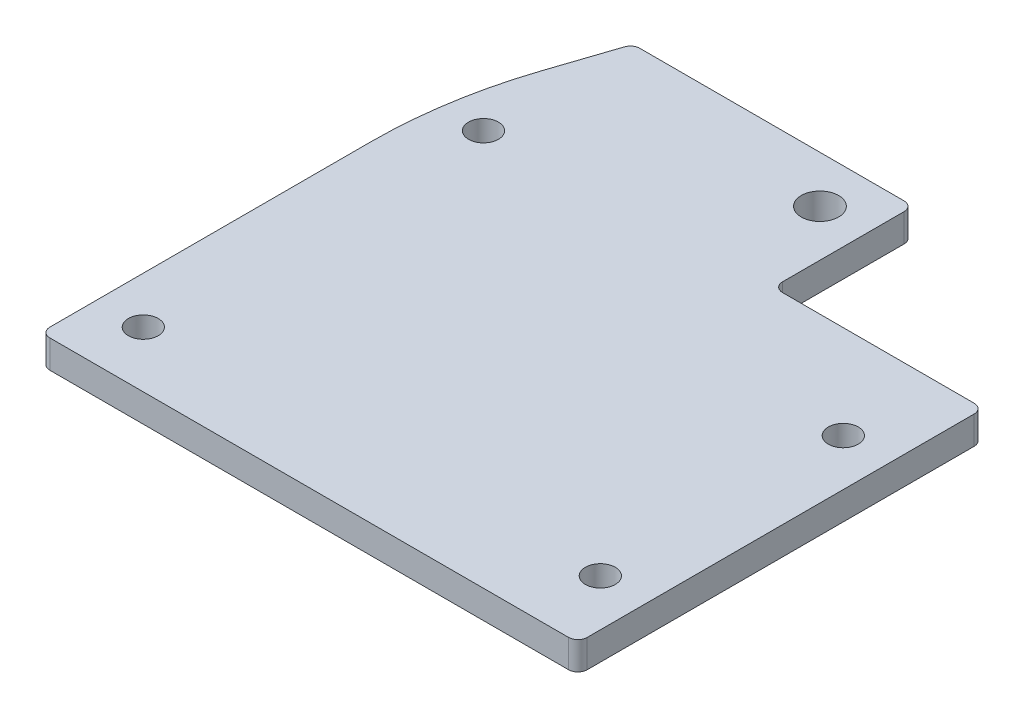
ISO-10303-21;
HEADER;
FILE_DESCRIPTION(('STEP AP214'),'2;1');
FILE_NAME('part.step','',(''),(''),'','','');
FILE_SCHEMA(('AUTOMOTIVE_DESIGN { 1 0 10303 214 1 1 1 1 }'));
ENDSEC;
DATA;
#1=APPLICATION_CONTEXT('core data for automotive mechanical design processes');
#2=APPLICATION_PROTOCOL_DEFINITION('international standard','automotive_design',2000,#1);
#3=PRODUCT_CONTEXT('',#1,'mechanical');
#4=PRODUCT('Part','Part','',(#3));
#5=PRODUCT_RELATED_PRODUCT_CATEGORY('part','',(#4));
#6=PRODUCT_DEFINITION_FORMATION('','',#4);
#7=PRODUCT_DEFINITION_CONTEXT('part definition',#1,'design');
#8=PRODUCT_DEFINITION('design','',#6,#7);
#9=PRODUCT_DEFINITION_SHAPE('','',#8);
#10=(LENGTH_UNIT() NAMED_UNIT(*) SI_UNIT(.MILLI.,.METRE.));
#11=(NAMED_UNIT(*) PLANE_ANGLE_UNIT() SI_UNIT($,.RADIAN.));
#12=(NAMED_UNIT(*) SI_UNIT($,.STERADIAN.) SOLID_ANGLE_UNIT());
#13=UNCERTAINTY_MEASURE_WITH_UNIT(LENGTH_MEASURE(1.E-05),#10,'distance_accuracy_value','');
#14=(GEOMETRIC_REPRESENTATION_CONTEXT(3) GLOBAL_UNCERTAINTY_ASSIGNED_CONTEXT((#13)) GLOBAL_UNIT_ASSIGNED_CONTEXT((#10,
#11,#12)) REPRESENTATION_CONTEXT('',''));
#15=CARTESIAN_POINT('',(0.,0.,0.));
#16=DIRECTION('',(0.,0.,1.));
#17=DIRECTION('',(1.,0.,0.));
#18=AXIS2_PLACEMENT_3D('',#15,#16,#17);
#19=CARTESIAN_POINT('',(0.,3.,0.));
#20=DIRECTION('',(0.,-1.,0.));
#21=DIRECTION('',(0.,0.,-1.));
#22=AXIS2_PLACEMENT_3D('',#19,#20,#21);
#23=PLANE('',#22);
#24=DIRECTION('',(0.,0.,1.));
#25=VECTOR('',#24,1.);
#26=CARTESIAN_POINT('',(0.,3.,0.));
#27=LINE('',#26,#25);
#28=CARTESIAN_POINT('',(0.,3.,-35.286116991581));
#29=VERTEX_POINT('',#28);
#30=CARTESIAN_POINT('',(0.,3.,-1.));
#31=VERTEX_POINT('',#30);
#32=EDGE_CURVE('E195',#29,#31,#27,.T.);
#33=ORIENTED_EDGE('',*,*,#32,.T.);
#34=CARTESIAN_POINT('',(1.,3.,-1.));
#35=DIRECTION('',(0.,-1.,0.));
#36=DIRECTION('',(0.,0.,-1.));
#37=AXIS2_PLACEMENT_3D('',#34,#35,#36);
#38=CIRCLE('',#37,1.);
#39=CARTESIAN_POINT('',(1.,3.,0.));
#40=VERTEX_POINT('',#39);
#41=EDGE_CURVE('E269',#31,#40,#38,.F.);
#42=ORIENTED_EDGE('',*,*,#41,.T.);
#43=DIRECTION('',(1.,0.,0.));
#44=VECTOR('',#43,1.);
#45=CARTESIAN_POINT('',(0.,3.,0.));
#46=LINE('',#45,#44);
#47=CARTESIAN_POINT('',(56.5,3.,0.));
#48=VERTEX_POINT('',#47);
#49=EDGE_CURVE('E199',#40,#48,#46,.T.);
#50=ORIENTED_EDGE('',*,*,#49,.T.);
#51=CARTESIAN_POINT('',(56.5,3.,-1.));
#52=DIRECTION('',(0.,-1.,0.));
#53=DIRECTION('',(0.,0.,-1.));
#54=AXIS2_PLACEMENT_3D('',#51,#52,#53);
#55=CIRCLE('',#54,1.);
#56=CARTESIAN_POINT('',(57.5,3.,-1.));
#57=VERTEX_POINT('',#56);
#58=EDGE_CURVE('E266',#48,#57,#55,.F.);
#59=ORIENTED_EDGE('',*,*,#58,.T.);
#60=DIRECTION('',(0.,0.,-1.));
#61=VECTOR('',#60,1.);
#62=CARTESIAN_POINT('',(57.5,3.,0.));
#63=LINE('',#62,#61);
#64=CARTESIAN_POINT('',(57.5,3.,-42.4));
#65=VERTEX_POINT('',#64);
#66=EDGE_CURVE('E209',#57,#65,#63,.T.);
#67=ORIENTED_EDGE('',*,*,#66,.T.);
#68=CARTESIAN_POINT('',(56.5,3.,-42.4));
#69=DIRECTION('',(0.,-1.,0.));
#70=DIRECTION('',(0.,0.,-1.));
#71=AXIS2_PLACEMENT_3D('',#68,#69,#70);
#72=CIRCLE('',#71,1.);
#73=CARTESIAN_POINT('',(56.5,3.,-43.4));
#74=VERTEX_POINT('',#73);
#75=EDGE_CURVE('E263',#65,#74,#72,.F.);
#76=ORIENTED_EDGE('',*,*,#75,.T.);
#77=DIRECTION('',(-1.,0.,0.));
#78=VECTOR('',#77,1.);
#79=CARTESIAN_POINT('',(35.,3.,-43.4));
#80=LINE('',#79,#78);
#81=CARTESIAN_POINT('',(36.,3.,-43.4));
#82=VERTEX_POINT('',#81);
#83=EDGE_CURVE('E213',#74,#82,#80,.T.);
#84=ORIENTED_EDGE('',*,*,#83,.T.);
#85=CARTESIAN_POINT('',(36.,3.,-44.4));
#86=DIRECTION('',(0.,-1.,0.));
#87=DIRECTION('',(0.,0.,-1.));
#88=AXIS2_PLACEMENT_3D('',#85,#86,#87);
#89=CIRCLE('',#88,1.);
#90=CARTESIAN_POINT('',(35.,3.,-44.4));
#91=VERTEX_POINT('',#90);
#92=EDGE_CURVE('E12',#82,#91,#89,.T.);
#93=ORIENTED_EDGE('',*,*,#92,.T.);
#94=DIRECTION('',(0.,0.,-1.));
#95=VECTOR('',#94,1.);
#96=CARTESIAN_POINT('',(35.,3.,-58.4));
#97=LINE('',#96,#95);
#98=CARTESIAN_POINT('',(35.,3.,-57.4));
#99=VERTEX_POINT('',#98);
#100=EDGE_CURVE('E218',#91,#99,#97,.T.);
#101=ORIENTED_EDGE('',*,*,#100,.T.);
#102=CARTESIAN_POINT('',(34.,3.,-57.4));
#103=DIRECTION('',(0.,-1.,0.));
#104=DIRECTION('',(0.,0.,-1.));
#105=AXIS2_PLACEMENT_3D('',#102,#103,#104);
#106=CIRCLE('',#105,1.);
#107=CARTESIAN_POINT('',(34.,3.,-58.4));
#108=VERTEX_POINT('',#107);
#109=EDGE_CURVE('E67',#99,#108,#106,.F.);
#110=ORIENTED_EDGE('',*,*,#109,.T.);
#111=DIRECTION('',(-1.,0.,0.));
#112=VECTOR('',#111,1.);
#113=CARTESIAN_POINT('',(0.,3.,-58.4));
#114=LINE('',#113,#112);
#115=CARTESIAN_POINT('',(5.72075922005612,3.,-58.4));
#116=VERTEX_POINT('',#115);
#117=EDGE_CURVE('E165',#108,#116,#114,.T.);
#118=ORIENTED_EDGE('',*,*,#117,.T.);
#119=CARTESIAN_POINT('',(5.72075922005612,3.,-57.4));
#120=DIRECTION('',(0.,-1.,0.));
#121=DIRECTION('',(0.,0.,-1.));
#122=AXIS2_PLACEMENT_3D('',#119,#120,#121);
#123=CIRCLE('',#122,1.);
#124=CARTESIAN_POINT('',(4.77207592200561,3.,-57.7162277660168));
#125=VERTEX_POINT('',#124);
#126=EDGE_CURVE('E59',#116,#125,#123,.F.);
#127=ORIENTED_EDGE('',*,*,#126,.T.);
#128=DIRECTION('',(0.316227766016838,0.,-0.948683298050514));
#129=VECTOR('',#128,1.);
#130=CARTESIAN_POINT('',(0.,3.,-43.4));
#131=LINE('',#130,#129);
#132=CARTESIAN_POINT('',(2.56583509747431,3.,-51.0975052924229));
#133=VERTEX_POINT('',#132);
#134=EDGE_CURVE('E162',#133,#125,#131,.T.);
#135=ORIENTED_EDGE('',*,*,#134,.F.);
#136=CARTESIAN_POINT('',(50.,3.,-35.286116991581));
#137=DIRECTION('',(0.,-1.,0.));
#138=DIRECTION('',(0.,0.,-1.));
#139=AXIS2_PLACEMENT_3D('',#136,#137,#138);
#140=CIRCLE('',#139,50.);
#141=EDGE_CURVE('E147',#133,#29,#140,.F.);
#142=ORIENTED_EDGE('',*,*,#141,.T.);
#143=EDGE_LOOP('',(#33,#42,#50,#59,#67,#76,#84,#93,#101,#110,#118,#127,#135,#142));
#144=FACE_BOUND('',#143,.T.);
#145=CARTESIAN_POINT('',(52.5,3.,-7.4));
#146=DIRECTION('',(0.,1.,0.));
#147=DIRECTION('',(0.,0.,1.));
#148=AXIS2_PLACEMENT_3D('',#145,#146,#147);
#149=CIRCLE('',#148,1.6);
#150=CARTESIAN_POINT('',(52.5,3.,-5.8));
#151=VERTEX_POINT('',#150);
#152=EDGE_CURVE('E183',#151,#151,#149,.T.);
#153=ORIENTED_EDGE('',*,*,#152,.F.);
#154=EDGE_LOOP('',(#153));
#155=FACE_BOUND('',#154,.T.);
#156=CARTESIAN_POINT('',(52.5,3.,-33.4));
#157=DIRECTION('',(0.,1.,0.));
#158=DIRECTION('',(0.,0.,1.));
#159=AXIS2_PLACEMENT_3D('',#156,#157,#158);
#160=CIRCLE('',#159,1.6);
#161=CARTESIAN_POINT('',(52.5,3.,-31.8));
#162=VERTEX_POINT('',#161);
#163=EDGE_CURVE('E194',#162,#162,#160,.T.);
#164=ORIENTED_EDGE('',*,*,#163,.F.);
#165=EDGE_LOOP('',(#164));
#166=FACE_BOUND('',#165,.T.);
#167=CARTESIAN_POINT('',(30.,3.,-53.4));
#168=DIRECTION('',(0.,1.,0.));
#169=DIRECTION('',(0.,0.,1.));
#170=AXIS2_PLACEMENT_3D('',#167,#168,#169);
#171=CIRCLE('',#170,2.);
#172=CARTESIAN_POINT('',(30.,3.,-51.4));
#173=VERTEX_POINT('',#172);
#174=EDGE_CURVE('E532',#173,#173,#171,.T.);
#175=ORIENTED_EDGE('',*,*,#174,.F.);
#176=EDGE_LOOP('',(#175));
#177=FACE_BOUND('',#176,.T.);
#178=CARTESIAN_POINT('',(5.,3.,-42.4));
#179=DIRECTION('',(0.,1.,0.));
#180=DIRECTION('',(0.,0.,1.));
#181=AXIS2_PLACEMENT_3D('',#178,#179,#180);
#182=CIRCLE('',#181,1.6);
#183=CARTESIAN_POINT('',(5.,3.,-40.8));
#184=VERTEX_POINT('',#183);
#185=EDGE_CURVE('E526',#184,#184,#182,.T.);
#186=ORIENTED_EDGE('',*,*,#185,.F.);
#187=EDGE_LOOP('',(#186));
#188=FACE_BOUND('',#187,.T.);
#189=CARTESIAN_POINT('',(5.,3.,-6.));
#190=DIRECTION('',(0.,1.,0.));
#191=DIRECTION('',(0.,0.,-1.));
#192=AXIS2_PLACEMENT_3D('',#189,#190,#191);
#193=CIRCLE('',#192,1.6);
#194=CARTESIAN_POINT('',(5.,3.,-7.6));
#195=VERTEX_POINT('',#194);
#196=EDGE_CURVE('E519',#195,#195,#193,.T.);
#197=ORIENTED_EDGE('',*,*,#196,.F.);
#198=EDGE_LOOP('',(#197));
#199=FACE_BOUND('',#198,.T.);
#200=ADVANCED_FACE('F42',(#144,#155,#166,#177,#188,#199),#23,.F.);
#201=CARTESIAN_POINT('',(0.,0.,0.));
#202=DIRECTION('',(0.,-1.,0.));
#203=DIRECTION('',(0.,0.,-1.));
#204=AXIS2_PLACEMENT_3D('',#201,#202,#203);
#205=PLANE('',#204);
#206=DIRECTION('',(1.,0.,0.));
#207=VECTOR('',#206,1.);
#208=CARTESIAN_POINT('',(0.,0.,0.));
#209=LINE('',#208,#207);
#210=CARTESIAN_POINT('',(1.,0.,0.));
#211=VERTEX_POINT('',#210);
#212=CARTESIAN_POINT('',(56.5,0.,0.));
#213=VERTEX_POINT('',#212);
#214=EDGE_CURVE('E226',#211,#213,#209,.T.);
#215=ORIENTED_EDGE('',*,*,#214,.F.);
#216=CARTESIAN_POINT('',(1.,0.,-1.));
#217=DIRECTION('',(0.,-1.,0.));
#218=DIRECTION('',(0.,0.,-1.));
#219=AXIS2_PLACEMENT_3D('',#216,#217,#218);
#220=CIRCLE('',#219,1.);
#221=CARTESIAN_POINT('',(0.,0.,-1.));
#222=VERTEX_POINT('',#221);
#223=EDGE_CURVE('E256',#211,#222,#220,.T.);
#224=ORIENTED_EDGE('',*,*,#223,.T.);
#225=DIRECTION('',(0.,0.,1.));
#226=VECTOR('',#225,1.);
#227=CARTESIAN_POINT('',(0.,0.,0.));
#228=LINE('',#227,#226);
#229=CARTESIAN_POINT('',(0.,0.,-35.286116991581));
#230=VERTEX_POINT('',#229);
#231=EDGE_CURVE('E189',#230,#222,#228,.T.);
#232=ORIENTED_EDGE('',*,*,#231,.F.);
#233=CARTESIAN_POINT('',(50.,0.,-35.286116991581));
#234=DIRECTION('',(0.,-1.,0.));
#235=DIRECTION('',(0.,0.,-1.));
#236=AXIS2_PLACEMENT_3D('',#233,#234,#235);
#237=CIRCLE('',#236,50.);
#238=CARTESIAN_POINT('',(2.56583509747431,0.,-51.0975052924229));
#239=VERTEX_POINT('',#238);
#240=EDGE_CURVE('E241',#230,#239,#237,.T.);
#241=ORIENTED_EDGE('',*,*,#240,.T.);
#242=DIRECTION('',(0.316227766016838,0.,-0.948683298050514));
#243=VECTOR('',#242,1.);
#244=CARTESIAN_POINT('',(0.,0.,-43.4));
#245=LINE('',#244,#243);
#246=CARTESIAN_POINT('',(4.77207592200561,0.,-57.7162277660168));
#247=VERTEX_POINT('',#246);
#248=EDGE_CURVE('E164',#239,#247,#245,.T.);
#249=ORIENTED_EDGE('',*,*,#248,.T.);
#250=CARTESIAN_POINT('',(5.72075922005612,0.,-57.4));
#251=DIRECTION('',(0.,-1.,0.));
#252=DIRECTION('',(0.,0.,-1.));
#253=AXIS2_PLACEMENT_3D('',#250,#251,#252);
#254=CIRCLE('',#253,1.);
#255=CARTESIAN_POINT('',(5.72075922005612,0.,-58.4));
#256=VERTEX_POINT('',#255);
#257=EDGE_CURVE('E248',#247,#256,#254,.T.);
#258=ORIENTED_EDGE('',*,*,#257,.T.);
#259=DIRECTION('',(-1.,0.,0.));
#260=VECTOR('',#259,1.);
#261=CARTESIAN_POINT('',(0.,0.,-58.4));
#262=LINE('',#261,#260);
#263=CARTESIAN_POINT('',(34.,0.,-58.4));
#264=VERTEX_POINT('',#263);
#265=EDGE_CURVE('E200',#264,#256,#262,.T.);
#266=ORIENTED_EDGE('',*,*,#265,.F.);
#267=CARTESIAN_POINT('',(34.,0.,-57.4));
#268=DIRECTION('',(0.,-1.,0.));
#269=DIRECTION('',(0.,0.,-1.));
#270=AXIS2_PLACEMENT_3D('',#267,#268,#269);
#271=CIRCLE('',#270,1.);
#272=CARTESIAN_POINT('',(35.,0.,-57.4));
#273=VERTEX_POINT('',#272);
#274=EDGE_CURVE('E250',#264,#273,#271,.T.);
#275=ORIENTED_EDGE('',*,*,#274,.T.);
#276=DIRECTION('',(0.,0.,-1.));
#277=VECTOR('',#276,1.);
#278=CARTESIAN_POINT('',(35.,0.,-58.4));
#279=LINE('',#278,#277);
#280=CARTESIAN_POINT('',(35.,0.,-44.4));
#281=VERTEX_POINT('',#280);
#282=EDGE_CURVE('E235',#281,#273,#279,.T.);
#283=ORIENTED_EDGE('',*,*,#282,.F.);
#284=CARTESIAN_POINT('',(36.,0.,-44.4));
#285=DIRECTION('',(0.,-1.,0.));
#286=DIRECTION('',(0.,0.,-1.));
#287=AXIS2_PLACEMENT_3D('',#284,#285,#286);
#288=CIRCLE('',#287,1.);
#289=CARTESIAN_POINT('',(36.,0.,-43.4));
#290=VERTEX_POINT('',#289);
#291=EDGE_CURVE('E52',#281,#290,#288,.F.);
#292=ORIENTED_EDGE('',*,*,#291,.T.);
#293=DIRECTION('',(-1.,0.,0.));
#294=VECTOR('',#293,1.);
#295=CARTESIAN_POINT('',(35.,0.,-43.4));
#296=LINE('',#295,#294);
#297=CARTESIAN_POINT('',(56.5,0.,-43.4));
#298=VERTEX_POINT('',#297);
#299=EDGE_CURVE('E232',#298,#290,#296,.T.);
#300=ORIENTED_EDGE('',*,*,#299,.F.);
#301=CARTESIAN_POINT('',(56.5,0.,-42.4));
#302=DIRECTION('',(0.,-1.,0.));
#303=DIRECTION('',(0.,0.,-1.));
#304=AXIS2_PLACEMENT_3D('',#301,#302,#303);
#305=CIRCLE('',#304,1.);
#306=CARTESIAN_POINT('',(57.5,0.,-42.4));
#307=VERTEX_POINT('',#306);
#308=EDGE_CURVE('E252',#298,#307,#305,.T.);
#309=ORIENTED_EDGE('',*,*,#308,.T.);
#310=DIRECTION('',(0.,0.,-1.));
#311=VECTOR('',#310,1.);
#312=CARTESIAN_POINT('',(57.5,0.,0.));
#313=LINE('',#312,#311);
#314=CARTESIAN_POINT('',(57.5,0.,-1.));
#315=VERTEX_POINT('',#314);
#316=EDGE_CURVE('E229',#315,#307,#313,.T.);
#317=ORIENTED_EDGE('',*,*,#316,.F.);
#318=CARTESIAN_POINT('',(56.5,0.,-1.));
#319=DIRECTION('',(0.,-1.,0.));
#320=DIRECTION('',(0.,0.,-1.));
#321=AXIS2_PLACEMENT_3D('',#318,#319,#320);
#322=CIRCLE('',#321,1.);
#323=EDGE_CURVE('E254',#315,#213,#322,.T.);
#324=ORIENTED_EDGE('',*,*,#323,.T.);
#325=EDGE_LOOP('',(#215,#224,#232,#241,#249,#258,#266,#275,#283,#292,#300,#309,#317,#324));
#326=FACE_BOUND('',#325,.T.);
#327=CARTESIAN_POINT('',(5.,0.,-42.4));
#328=DIRECTION('',(0.,1.,0.));
#329=DIRECTION('',(0.,0.,1.));
#330=AXIS2_PLACEMENT_3D('',#327,#328,#329);
#331=CIRCLE('',#330,1.6);
#332=CARTESIAN_POINT('',(5.,0.,-40.8));
#333=VERTEX_POINT('',#332);
#334=EDGE_CURVE('E523',#333,#333,#331,.T.);
#335=ORIENTED_EDGE('',*,*,#334,.T.);
#336=EDGE_LOOP('',(#335));
#337=FACE_BOUND('',#336,.T.);
#338=CARTESIAN_POINT('',(52.5,0.,-33.4));
#339=DIRECTION('',(0.,1.,0.));
#340=DIRECTION('',(0.,0.,1.));
#341=AXIS2_PLACEMENT_3D('',#338,#339,#340);
#342=CIRCLE('',#341,1.6);
#343=CARTESIAN_POINT('',(52.5,0.,-31.8));
#344=VERTEX_POINT('',#343);
#345=EDGE_CURVE('E191',#344,#344,#342,.T.);
#346=ORIENTED_EDGE('',*,*,#345,.T.);
#347=EDGE_LOOP('',(#346));
#348=FACE_BOUND('',#347,.T.);
#349=CARTESIAN_POINT('',(52.5,0.,-7.4));
#350=DIRECTION('',(0.,1.,0.));
#351=DIRECTION('',(0.,0.,1.));
#352=AXIS2_PLACEMENT_3D('',#349,#350,#351);
#353=CIRCLE('',#352,1.6);
#354=CARTESIAN_POINT('',(52.5,0.,-5.8));
#355=VERTEX_POINT('',#354);
#356=EDGE_CURVE('E190',#355,#355,#353,.T.);
#357=ORIENTED_EDGE('',*,*,#356,.T.);
#358=EDGE_LOOP('',(#357));
#359=FACE_BOUND('',#358,.T.);
#360=CARTESIAN_POINT('',(30.,0.,-53.4));
#361=DIRECTION('',(0.,1.,0.));
#362=DIRECTION('',(0.,0.,1.));
#363=AXIS2_PLACEMENT_3D('',#360,#361,#362);
#364=CIRCLE('',#363,2.);
#365=CARTESIAN_POINT('',(30.,0.,-51.4));
#366=VERTEX_POINT('',#365);
#367=EDGE_CURVE('E515',#366,#366,#364,.T.);
#368=ORIENTED_EDGE('',*,*,#367,.T.);
#369=EDGE_LOOP('',(#368));
#370=FACE_BOUND('',#369,.T.);
#371=CARTESIAN_POINT('',(5.,0.,-6.));
#372=DIRECTION('',(0.,1.,0.));
#373=DIRECTION('',(0.,0.,-1.));
#374=AXIS2_PLACEMENT_3D('',#371,#372,#373);
#375=CIRCLE('',#374,1.6);
#376=CARTESIAN_POINT('',(5.,0.,-7.6));
#377=VERTEX_POINT('',#376);
#378=EDGE_CURVE('E171',#377,#377,#375,.T.);
#379=ORIENTED_EDGE('',*,*,#378,.T.);
#380=EDGE_LOOP('',(#379));
#381=FACE_BOUND('',#380,.T.);
#382=ADVANCED_FACE('F297',(#326,#337,#348,#359,#370,#381),#205,.T.);
#383=CARTESIAN_POINT('',(0.,3.,0.));
#384=DIRECTION('',(1.,0.,0.));
#385=DIRECTION('',(0.,0.,-1.));
#386=AXIS2_PLACEMENT_3D('',#383,#384,#385);
#387=PLANE('',#386);
#388=ORIENTED_EDGE('',*,*,#231,.T.);
#389=DIRECTION('',(0.,-1.,0.));
#390=VECTOR('',#389,1.);
#391=CARTESIAN_POINT('',(0.,3.,-1.));
#392=LINE('',#391,#390);
#393=EDGE_CURVE('E258',#222,#31,#392,.F.);
#394=ORIENTED_EDGE('',*,*,#393,.T.);
#395=ORIENTED_EDGE('',*,*,#32,.F.);
#396=DIRECTION('',(0.,1.,0.));
#397=VECTOR('',#396,1.);
#398=CARTESIAN_POINT('',(0.,3.,-35.286116991581));
#399=LINE('',#398,#397);
#400=EDGE_CURVE('E152',#29,#230,#399,.F.);
#401=ORIENTED_EDGE('',*,*,#400,.T.);
#402=EDGE_LOOP('',(#388,#394,#395,#401));
#403=FACE_BOUND('',#402,.T.);
#404=ADVANCED_FACE('F328',(#403),#387,.F.);
#405=CARTESIAN_POINT('',(0.,3.,0.));
#406=DIRECTION('',(0.,0.,-1.));
#407=DIRECTION('',(-1.,0.,0.));
#408=AXIS2_PLACEMENT_3D('',#405,#406,#407);
#409=PLANE('',#408);
#410=ORIENTED_EDGE('',*,*,#49,.F.);
#411=DIRECTION('',(0.,-1.,0.));
#412=VECTOR('',#411,1.);
#413=CARTESIAN_POINT('',(1.,3.,0.));
#414=LINE('',#413,#412);
#415=EDGE_CURVE('E245',#40,#211,#414,.T.);
#416=ORIENTED_EDGE('',*,*,#415,.T.);
#417=ORIENTED_EDGE('',*,*,#214,.T.);
#418=DIRECTION('',(0.,-1.,0.));
#419=VECTOR('',#418,1.);
#420=CARTESIAN_POINT('',(56.5,3.,0.));
#421=LINE('',#420,#419);
#422=EDGE_CURVE('E243',#213,#48,#421,.F.);
#423=ORIENTED_EDGE('',*,*,#422,.T.);
#424=EDGE_LOOP('',(#410,#416,#417,#423));
#425=FACE_BOUND('',#424,.T.);
#426=ADVANCED_FACE('F343',(#425),#409,.F.);
#427=CARTESIAN_POINT('',(57.5,3.,0.));
#428=DIRECTION('',(-1.,0.,0.));
#429=DIRECTION('',(0.,0.,1.));
#430=AXIS2_PLACEMENT_3D('',#427,#428,#429);
#431=PLANE('',#430);
#432=ORIENTED_EDGE('',*,*,#66,.F.);
#433=DIRECTION('',(0.,-1.,0.));
#434=VECTOR('',#433,1.);
#435=CARTESIAN_POINT('',(57.5,3.,-1.));
#436=LINE('',#435,#434);
#437=EDGE_CURVE('E274',#57,#315,#436,.T.);
#438=ORIENTED_EDGE('',*,*,#437,.T.);
#439=ORIENTED_EDGE('',*,*,#316,.T.);
#440=DIRECTION('',(0.,-1.,0.));
#441=VECTOR('',#440,1.);
#442=CARTESIAN_POINT('',(57.5,3.,-42.4));
#443=LINE('',#442,#441);
#444=EDGE_CURVE('E272',#307,#65,#443,.F.);
#445=ORIENTED_EDGE('',*,*,#444,.T.);
#446=EDGE_LOOP('',(#432,#438,#439,#445));
#447=FACE_BOUND('',#446,.T.);
#448=ADVANCED_FACE('F340',(#447),#431,.F.);
#449=CARTESIAN_POINT('',(35.,3.,-43.4));
#450=DIRECTION('',(0.,0.,1.));
#451=DIRECTION('',(1.,0.,0.));
#452=AXIS2_PLACEMENT_3D('',#449,#450,#451);
#453=PLANE('',#452);
#454=ORIENTED_EDGE('',*,*,#83,.F.);
#455=DIRECTION('',(0.,-1.,0.));
#456=VECTOR('',#455,1.);
#457=CARTESIAN_POINT('',(56.5,3.,-43.4));
#458=LINE('',#457,#456);
#459=EDGE_CURVE('E279',#74,#298,#458,.T.);
#460=ORIENTED_EDGE('',*,*,#459,.T.);
#461=ORIENTED_EDGE('',*,*,#299,.T.);
#462=DIRECTION('',(0.,-1.,0.));
#463=VECTOR('',#462,1.);
#464=CARTESIAN_POINT('',(36.,3.,-43.4));
#465=LINE('',#464,#463);
#466=EDGE_CURVE('E277',#290,#82,#465,.F.);
#467=ORIENTED_EDGE('',*,*,#466,.T.);
#468=EDGE_LOOP('',(#454,#460,#461,#467));
#469=FACE_BOUND('',#468,.T.);
#470=ADVANCED_FACE('F304',(#469),#453,.F.);
#471=CARTESIAN_POINT('',(35.,3.,-58.4));
#472=DIRECTION('',(-1.,0.,0.));
#473=DIRECTION('',(0.,0.,1.));
#474=AXIS2_PLACEMENT_3D('',#471,#472,#473);
#475=PLANE('',#474);
#476=ORIENTED_EDGE('',*,*,#100,.F.);
#477=DIRECTION('',(0.,-1.,0.));
#478=VECTOR('',#477,1.);
#479=CARTESIAN_POINT('',(35.,0.,-44.4));
#480=LINE('',#479,#478);
#481=EDGE_CURVE('E284',#91,#281,#480,.T.);
#482=ORIENTED_EDGE('',*,*,#481,.T.);
#483=ORIENTED_EDGE('',*,*,#282,.T.);
#484=DIRECTION('',(0.,-1.,0.));
#485=VECTOR('',#484,1.);
#486=CARTESIAN_POINT('',(35.,3.,-57.4));
#487=LINE('',#486,#485);
#488=EDGE_CURVE('E282',#273,#99,#487,.F.);
#489=ORIENTED_EDGE('',*,*,#488,.T.);
#490=EDGE_LOOP('',(#476,#482,#483,#489));
#491=FACE_BOUND('',#490,.T.);
#492=ADVANCED_FACE('F310',(#491),#475,.F.);
#493=CARTESIAN_POINT('',(0.,3.,-58.4));
#494=DIRECTION('',(0.,0.,1.));
#495=DIRECTION('',(1.,0.,0.));
#496=AXIS2_PLACEMENT_3D('',#493,#494,#495);
#497=PLANE('',#496);
#498=ORIENTED_EDGE('',*,*,#117,.F.);
#499=DIRECTION('',(0.,-1.,0.));
#500=VECTOR('',#499,1.);
#501=CARTESIAN_POINT('',(34.,3.,-58.4));
#502=LINE('',#501,#500);
#503=EDGE_CURVE('E289',#108,#264,#502,.T.);
#504=ORIENTED_EDGE('',*,*,#503,.T.);
#505=ORIENTED_EDGE('',*,*,#265,.T.);
#506=DIRECTION('',(0.,1.,0.));
#507=VECTOR('',#506,1.);
#508=CARTESIAN_POINT('',(5.72075922005612,3.,-58.4));
#509=LINE('',#508,#507);
#510=EDGE_CURVE('E287',#256,#116,#509,.T.);
#511=ORIENTED_EDGE('',*,*,#510,.T.);
#512=EDGE_LOOP('',(#498,#504,#505,#511));
#513=FACE_BOUND('',#512,.T.);
#514=ADVANCED_FACE('F317',(#513),#497,.F.);
#515=CARTESIAN_POINT('',(52.5,3.,-7.4));
#516=DIRECTION('',(0.,-1.,0.));
#517=DIRECTION('',(0.,0.,-1.));
#518=AXIS2_PLACEMENT_3D('',#515,#516,#517);
#519=CYLINDRICAL_SURFACE('',#518,1.6);
#520=ORIENTED_EDGE('',*,*,#152,.T.);
#521=EDGE_LOOP('',(#520));
#522=FACE_BOUND('',#521,.T.);
#523=ORIENTED_EDGE('',*,*,#356,.F.);
#524=EDGE_LOOP('',(#523));
#525=FACE_BOUND('',#524,.T.);
#526=ADVANCED_FACE('F331',(#522,#525),#519,.F.);
#527=CARTESIAN_POINT('',(52.5,3.,-33.4));
#528=DIRECTION('',(0.,-1.,0.));
#529=DIRECTION('',(0.,0.,-1.));
#530=AXIS2_PLACEMENT_3D('',#527,#528,#529);
#531=CYLINDRICAL_SURFACE('',#530,1.6);
#532=ORIENTED_EDGE('',*,*,#163,.T.);
#533=EDGE_LOOP('',(#532));
#534=FACE_BOUND('',#533,.T.);
#535=ORIENTED_EDGE('',*,*,#345,.F.);
#536=EDGE_LOOP('',(#535));
#537=FACE_BOUND('',#536,.T.);
#538=ADVANCED_FACE('F436',(#534,#537),#531,.F.);
#539=CARTESIAN_POINT('',(30.,3.,-53.4));
#540=DIRECTION('',(0.,-1.,0.));
#541=DIRECTION('',(0.,0.,-1.));
#542=AXIS2_PLACEMENT_3D('',#539,#540,#541);
#543=CYLINDRICAL_SURFACE('',#542,2.);
#544=ORIENTED_EDGE('',*,*,#174,.T.);
#545=EDGE_LOOP('',(#544));
#546=FACE_BOUND('',#545,.T.);
#547=ORIENTED_EDGE('',*,*,#367,.F.);
#548=EDGE_LOOP('',(#547));
#549=FACE_BOUND('',#548,.T.);
#550=ADVANCED_FACE('F427',(#546,#549),#543,.F.);
#551=CARTESIAN_POINT('',(5.,3.,-42.4));
#552=DIRECTION('',(0.,-1.,0.));
#553=DIRECTION('',(0.,0.,-1.));
#554=AXIS2_PLACEMENT_3D('',#551,#552,#553);
#555=CYLINDRICAL_SURFACE('',#554,1.6);
#556=ORIENTED_EDGE('',*,*,#185,.T.);
#557=EDGE_LOOP('',(#556));
#558=FACE_BOUND('',#557,.T.);
#559=ORIENTED_EDGE('',*,*,#334,.F.);
#560=EDGE_LOOP('',(#559));
#561=FACE_BOUND('',#560,.T.);
#562=ADVANCED_FACE('F418',(#558,#561),#555,.F.);
#563=CARTESIAN_POINT('',(5.,3.,-6.));
#564=DIRECTION('',(0.,-1.,0.));
#565=DIRECTION('',(0.,0.,-1.));
#566=AXIS2_PLACEMENT_3D('',#563,#564,#565);
#567=CYLINDRICAL_SURFACE('',#566,1.6);
#568=ORIENTED_EDGE('',*,*,#196,.T.);
#569=EDGE_LOOP('',(#568));
#570=FACE_BOUND('',#569,.T.);
#571=ORIENTED_EDGE('',*,*,#378,.F.);
#572=EDGE_LOOP('',(#571));
#573=FACE_BOUND('',#572,.T.);
#574=ADVANCED_FACE('F410',(#570,#573),#567,.F.);
#575=CARTESIAN_POINT('',(0.,-15.8113883008419,-43.4));
#576=DIRECTION('',(0.948683298050514,0.,0.316227766016838));
#577=DIRECTION('',(0.316227766016838,0.,-0.948683298050514));
#578=AXIS2_PLACEMENT_3D('',#575,#576,#577);
#579=PLANE('',#578);
#580=ORIENTED_EDGE('',*,*,#134,.T.);
#581=DIRECTION('',(0.,1.,0.));
#582=VECTOR('',#581,1.);
#583=CARTESIAN_POINT('',(4.77207592200561,-15.8113883008419,-57.7162277660168));
#584=LINE('',#583,#582);
#585=EDGE_CURVE('E292',#125,#247,#584,.F.);
#586=ORIENTED_EDGE('',*,*,#585,.T.);
#587=ORIENTED_EDGE('',*,*,#248,.F.);
#588=DIRECTION('',(0.,1.,0.));
#589=VECTOR('',#588,1.);
#590=CARTESIAN_POINT('',(2.56583509747431,-15.8113883008419,-51.0975052924229));
#591=LINE('',#590,#589);
#592=EDGE_CURVE('E151',#239,#133,#591,.T.);
#593=ORIENTED_EDGE('',*,*,#592,.T.);
#594=EDGE_LOOP('',(#580,#586,#587,#593));
#595=FACE_BOUND('',#594,.T.);
#596=ADVANCED_FACE('F161',(#595),#579,.F.);
#597=CARTESIAN_POINT('',(50.,-15.8113883008419,-35.286116991581));
#598=DIRECTION('',(0.,1.,0.));
#599=DIRECTION('',(0.,0.,1.));
#600=AXIS2_PLACEMENT_3D('',#597,#598,#599);
#601=CYLINDRICAL_SURFACE('',#600,50.);
#602=ORIENTED_EDGE('',*,*,#240,.F.);
#603=ORIENTED_EDGE('',*,*,#400,.F.);
#604=ORIENTED_EDGE('',*,*,#141,.F.);
#605=ORIENTED_EDGE('',*,*,#592,.F.);
#606=EDGE_LOOP('',(#602,#603,#604,#605));
#607=FACE_BOUND('',#606,.T.);
#608=ADVANCED_FACE('F150',(#607),#601,.T.);
#609=CARTESIAN_POINT('',(1.,3.,-1.));
#610=DIRECTION('',(0.,-1.,0.));
#611=DIRECTION('',(0.,0.,-1.));
#612=AXIS2_PLACEMENT_3D('',#609,#610,#611);
#613=CYLINDRICAL_SURFACE('',#612,1.);
#614=ORIENTED_EDGE('',*,*,#41,.F.);
#615=ORIENTED_EDGE('',*,*,#393,.F.);
#616=ORIENTED_EDGE('',*,*,#223,.F.);
#617=ORIENTED_EDGE('',*,*,#415,.F.);
#618=EDGE_LOOP('',(#614,#615,#616,#617));
#619=FACE_BOUND('',#618,.T.);
#620=ADVANCED_FACE('F353',(#619),#613,.T.);
#621=CARTESIAN_POINT('',(56.5,3.,-1.));
#622=DIRECTION('',(0.,-1.,0.));
#623=DIRECTION('',(0.,0.,-1.));
#624=AXIS2_PLACEMENT_3D('',#621,#622,#623);
#625=CYLINDRICAL_SURFACE('',#624,1.);
#626=ORIENTED_EDGE('',*,*,#58,.F.);
#627=ORIENTED_EDGE('',*,*,#422,.F.);
#628=ORIENTED_EDGE('',*,*,#323,.F.);
#629=ORIENTED_EDGE('',*,*,#437,.F.);
#630=EDGE_LOOP('',(#626,#627,#628,#629));
#631=FACE_BOUND('',#630,.T.);
#632=ADVANCED_FACE('F356',(#631),#625,.T.);
#633=CARTESIAN_POINT('',(56.5,3.,-42.4));
#634=DIRECTION('',(0.,-1.,0.));
#635=DIRECTION('',(0.,0.,-1.));
#636=AXIS2_PLACEMENT_3D('',#633,#634,#635);
#637=CYLINDRICAL_SURFACE('',#636,1.);
#638=ORIENTED_EDGE('',*,*,#75,.F.);
#639=ORIENTED_EDGE('',*,*,#444,.F.);
#640=ORIENTED_EDGE('',*,*,#308,.F.);
#641=ORIENTED_EDGE('',*,*,#459,.F.);
#642=EDGE_LOOP('',(#638,#639,#640,#641));
#643=FACE_BOUND('',#642,.T.);
#644=ADVANCED_FACE('F360',(#643),#637,.T.);
#645=CARTESIAN_POINT('',(36.,3.,-44.4));
#646=DIRECTION('',(0.,1.,0.));
#647=DIRECTION('',(0.,0.,1.));
#648=AXIS2_PLACEMENT_3D('',#645,#646,#647);
#649=CYLINDRICAL_SURFACE('',#648,1.);
#650=ORIENTED_EDGE('',*,*,#92,.F.);
#651=ORIENTED_EDGE('',*,*,#466,.F.);
#652=ORIENTED_EDGE('',*,*,#291,.F.);
#653=ORIENTED_EDGE('',*,*,#481,.F.);
#654=EDGE_LOOP('',(#650,#651,#652,#653));
#655=FACE_BOUND('',#654,.T.);
#656=ADVANCED_FACE('F307',(#655),#649,.F.);
#657=CARTESIAN_POINT('',(34.,3.,-57.4));
#658=DIRECTION('',(0.,-1.,0.));
#659=DIRECTION('',(0.,0.,-1.));
#660=AXIS2_PLACEMENT_3D('',#657,#658,#659);
#661=CYLINDRICAL_SURFACE('',#660,1.);
#662=ORIENTED_EDGE('',*,*,#109,.F.);
#663=ORIENTED_EDGE('',*,*,#488,.F.);
#664=ORIENTED_EDGE('',*,*,#274,.F.);
#665=ORIENTED_EDGE('',*,*,#503,.F.);
#666=EDGE_LOOP('',(#662,#663,#664,#665));
#667=FACE_BOUND('',#666,.T.);
#668=ADVANCED_FACE('F313',(#667),#661,.T.);
#669=CARTESIAN_POINT('',(5.72075922005612,3.,-57.4));
#670=DIRECTION('',(0.,1.,0.));
#671=DIRECTION('',(0.,0.,1.));
#672=AXIS2_PLACEMENT_3D('',#669,#670,#671);
#673=CYLINDRICAL_SURFACE('',#672,1.);
#674=ORIENTED_EDGE('',*,*,#257,.F.);
#675=ORIENTED_EDGE('',*,*,#585,.F.);
#676=ORIENTED_EDGE('',*,*,#126,.F.);
#677=ORIENTED_EDGE('',*,*,#510,.F.);
#678=EDGE_LOOP('',(#674,#675,#676,#677));
#679=FACE_BOUND('',#678,.T.);
#680=ADVANCED_FACE('F44',(#679),#673,.T.);
#681=CLOSED_SHELL('',(#200,#382,#404,#426,#448,#470,#492,#514,#526,#538,#550,#562,#574,#596,
#608,#620,#632,#644,#656,#668,#680));
#682=MANIFOLD_SOLID_BREP('B2',#681);
#683=ADVANCED_BREP_SHAPE_REPRESENTATION('',(#18,#682),#14);
#684=SHAPE_DEFINITION_REPRESENTATION(#9,#683);
ENDSEC;
END-ISO-10303-21;
